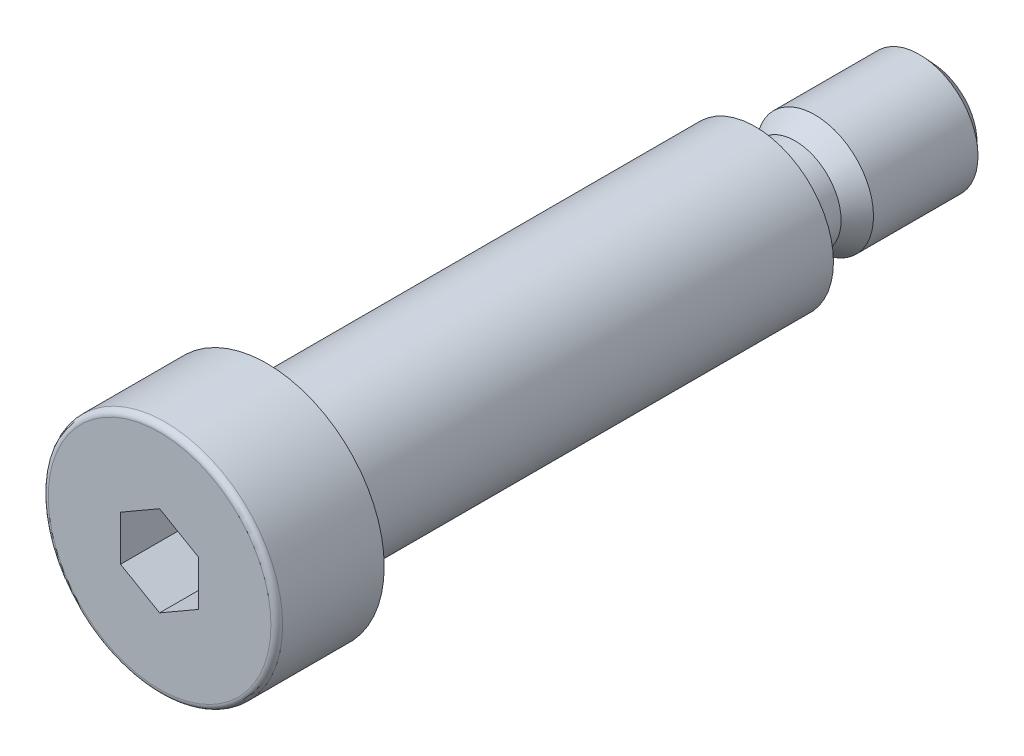
ISO-10303-21;
HEADER;
FILE_DESCRIPTION(('STEP AP214'),'2;1');
FILE_NAME('part.step','',(''),(''),'','','');
FILE_SCHEMA(('AUTOMOTIVE_DESIGN { 1 0 10303 214 1 1 1 1 }'));
ENDSEC;
DATA;
#1=APPLICATION_CONTEXT('core data for automotive mechanical design processes');
#2=APPLICATION_PROTOCOL_DEFINITION('international standard','automotive_design',2000,#1);
#3=PRODUCT_CONTEXT('',#1,'mechanical');
#4=PRODUCT('Part','Part','',(#3));
#5=PRODUCT_RELATED_PRODUCT_CATEGORY('part','',(#4));
#6=PRODUCT_DEFINITION_FORMATION('','',#4);
#7=PRODUCT_DEFINITION_CONTEXT('part definition',#1,'design');
#8=PRODUCT_DEFINITION('design','',#6,#7);
#9=PRODUCT_DEFINITION_SHAPE('','',#8);
#10=(LENGTH_UNIT() NAMED_UNIT(*) SI_UNIT(.MILLI.,.METRE.));
#11=(NAMED_UNIT(*) PLANE_ANGLE_UNIT() SI_UNIT($,.RADIAN.));
#12=(NAMED_UNIT(*) SI_UNIT($,.STERADIAN.) SOLID_ANGLE_UNIT());
#13=UNCERTAINTY_MEASURE_WITH_UNIT(LENGTH_MEASURE(1.E-05),#10,'distance_accuracy_value','');
#14=(GEOMETRIC_REPRESENTATION_CONTEXT(3) GLOBAL_UNCERTAINTY_ASSIGNED_CONTEXT((#13)) GLOBAL_UNIT_ASSIGNED_CONTEXT((#10,
#11,#12)) REPRESENTATION_CONTEXT('',''));
#15=CARTESIAN_POINT('',(0.,0.,0.));
#16=DIRECTION('',(0.,0.,1.));
#17=DIRECTION('',(1.,0.,0.));
#18=AXIS2_PLACEMENT_3D('',#15,#16,#17);
#19=CARTESIAN_POINT('',(0.,0.,36.));
#20=DIRECTION('',(0.,0.,1.));
#21=DIRECTION('',(1.,0.,0.));
#22=AXIS2_PLACEMENT_3D('',#19,#20,#21);
#23=PLANE('',#22);
#24=CARTESIAN_POINT('',(0.,0.,36.));
#25=DIRECTION('',(0.,0.,1.));
#26=DIRECTION('',(1.,0.,0.));
#27=AXIS2_PLACEMENT_3D('',#24,#25,#26);
#28=CIRCLE('',#27,11.4);
#29=CARTESIAN_POINT('',(11.4,0.,36.));
#30=VERTEX_POINT('',#29);
#31=EDGE_CURVE('E42',#30,#30,#28,.T.);
#32=ORIENTED_EDGE('',*,*,#31,.T.);
#33=EDGE_LOOP('',(#32));
#34=FACE_BOUND('',#33,.T.);
#35=DIRECTION('',(0.,1.,0.));
#36=VECTOR('',#35,1.);
#37=CARTESIAN_POINT('',(4.,-2.30940107675851,36.));
#38=LINE('',#37,#36);
#39=CARTESIAN_POINT('',(4.,-2.30940107675851,36.));
#40=VERTEX_POINT('',#39);
#41=CARTESIAN_POINT('',(4.,2.3094010767585,36.));
#42=VERTEX_POINT('',#41);
#43=EDGE_CURVE('E49',#40,#42,#38,.T.);
#44=ORIENTED_EDGE('',*,*,#43,.F.);
#45=DIRECTION('',(0.866025403784439,0.5,0.));
#46=VECTOR('',#45,1.);
#47=CARTESIAN_POINT('',(0.,-4.61880215351701,36.));
#48=LINE('',#47,#46);
#49=CARTESIAN_POINT('',(0.,-4.61880215351701,36.));
#50=VERTEX_POINT('',#49);
#51=EDGE_CURVE('E132',#50,#40,#48,.T.);
#52=ORIENTED_EDGE('',*,*,#51,.F.);
#53=DIRECTION('',(0.866025403784439,-0.5,0.));
#54=VECTOR('',#53,1.);
#55=CARTESIAN_POINT('',(-4.,-2.3094010767585,36.));
#56=LINE('',#55,#54);
#57=CARTESIAN_POINT('',(-4.,-2.3094010767585,36.));
#58=VERTEX_POINT('',#57);
#59=EDGE_CURVE('E130',#58,#50,#56,.T.);
#60=ORIENTED_EDGE('',*,*,#59,.F.);
#61=DIRECTION('',(0.,-1.,0.));
#62=VECTOR('',#61,1.);
#63=CARTESIAN_POINT('',(-4.,2.30940107675851,36.));
#64=LINE('',#63,#62);
#65=CARTESIAN_POINT('',(-4.,2.30940107675851,36.));
#66=VERTEX_POINT('',#65);
#67=EDGE_CURVE('E97',#66,#58,#64,.T.);
#68=ORIENTED_EDGE('',*,*,#67,.F.);
#69=DIRECTION('',(-0.866025403784439,-0.5,0.));
#70=VECTOR('',#69,1.);
#71=CARTESIAN_POINT('',(0.,4.61880215351701,36.));
#72=LINE('',#71,#70);
#73=CARTESIAN_POINT('',(0.,4.61880215351701,36.));
#74=VERTEX_POINT('',#73);
#75=EDGE_CURVE('E126',#74,#66,#72,.T.);
#76=ORIENTED_EDGE('',*,*,#75,.F.);
#77=DIRECTION('',(-0.866025403784439,0.5,0.));
#78=VECTOR('',#77,1.);
#79=CARTESIAN_POINT('',(4.,2.3094010767585,36.));
#80=LINE('',#79,#78);
#81=EDGE_CURVE('E123',#42,#74,#80,.T.);
#82=ORIENTED_EDGE('',*,*,#81,.F.);
#83=EDGE_LOOP('',(#44,#52,#60,#68,#76,#82));
#84=FACE_BOUND('',#83,.T.);
#85=ADVANCED_FACE('F34',(#34,#84),#23,.T.);
#86=CARTESIAN_POINT('',(0.,0.,-43.));
#87=DIRECTION('',(0.,0.,1.));
#88=DIRECTION('',(1.,0.,0.));
#89=AXIS2_PLACEMENT_3D('',#86,#87,#88);
#90=PLANE('',#89);
#91=CARTESIAN_POINT('',(0.,0.,-43.));
#92=DIRECTION('',(0.,0.,1.));
#93=DIRECTION('',(1.,0.,0.));
#94=AXIS2_PLACEMENT_3D('',#91,#92,#93);
#95=CIRCLE('',#94,4.7);
#96=CARTESIAN_POINT('',(4.7,0.,-43.));
#97=VERTEX_POINT('',#96);
#98=EDGE_CURVE('E162',#97,#97,#95,.T.);
#99=ORIENTED_EDGE('',*,*,#98,.F.);
#100=EDGE_LOOP('',(#99));
#101=FACE_BOUND('',#100,.T.);
#102=ADVANCED_FACE('F178',(#101),#90,.F.);
#103=CARTESIAN_POINT('',(0.,0.,-43.));
#104=DIRECTION('',(0.,0.,1.));
#105=DIRECTION('',(1.,0.,0.));
#106=AXIS2_PLACEMENT_3D('',#103,#104,#105);
#107=CONICAL_SURFACE('',#106,4.7,0.825376850520729);
#108=CARTESIAN_POINT('',(0.,0.,-41.8));
#109=DIRECTION('',(0.,0.,1.));
#110=DIRECTION('',(1.,0.,0.));
#111=AXIS2_PLACEMENT_3D('',#108,#109,#110);
#112=CIRCLE('',#111,6.);
#113=CARTESIAN_POINT('',(6.,0.,-41.8));
#114=VERTEX_POINT('',#113);
#115=EDGE_CURVE('E159',#114,#114,#112,.T.);
#116=ORIENTED_EDGE('',*,*,#115,.F.);
#117=EDGE_LOOP('',(#116));
#118=FACE_BOUND('',#117,.T.);
#119=ORIENTED_EDGE('',*,*,#98,.T.);
#120=EDGE_LOOP('',(#119));
#121=FACE_BOUND('',#120,.T.);
#122=ADVANCED_FACE('F182',(#118,#121),#107,.T.);
#123=CARTESIAN_POINT('',(0.,0.,36.));
#124=DIRECTION('',(0.,0.,1.));
#125=DIRECTION('',(1.,0.,0.));
#126=AXIS2_PLACEMENT_3D('',#123,#124,#125);
#127=CYLINDRICAL_SURFACE('',#126,6.);
#128=CARTESIAN_POINT('',(0.,0.,-31.1));
#129=DIRECTION('',(0.,0.,1.));
#130=DIRECTION('',(1.,0.,0.));
#131=AXIS2_PLACEMENT_3D('',#128,#129,#130);
#132=CIRCLE('',#131,6.);
#133=CARTESIAN_POINT('',(6.,0.,-31.1));
#134=VERTEX_POINT('',#133);
#135=EDGE_CURVE('E156',#134,#134,#132,.T.);
#136=ORIENTED_EDGE('',*,*,#135,.F.);
#137=EDGE_LOOP('',(#136));
#138=FACE_BOUND('',#137,.T.);
#139=ORIENTED_EDGE('',*,*,#115,.T.);
#140=EDGE_LOOP('',(#139));
#141=FACE_BOUND('',#140,.T.);
#142=ADVANCED_FACE('F188',(#138,#141),#127,.T.);
#143=CARTESIAN_POINT('',(0.,0.,-31.1));
#144=DIRECTION('',(0.,0.,-1.));
#145=DIRECTION('',(-1.,0.,0.));
#146=AXIS2_PLACEMENT_3D('',#143,#144,#145);
#147=CONICAL_SURFACE('',#146,6.,0.571837729916959);
#148=CARTESIAN_POINT('',(0.,0.,-29.08));
#149=DIRECTION('',(0.,0.,1.));
#150=DIRECTION('',(1.,0.,0.));
#151=AXIS2_PLACEMENT_3D('',#148,#149,#150);
#152=CIRCLE('',#151,4.70000000000001);
#153=CARTESIAN_POINT('',(4.70000000000001,0.,-29.08));
#154=VERTEX_POINT('',#153);
#155=EDGE_CURVE('E153',#154,#154,#152,.T.);
#156=ORIENTED_EDGE('',*,*,#155,.F.);
#157=EDGE_LOOP('',(#156));
#158=FACE_BOUND('',#157,.T.);
#159=ORIENTED_EDGE('',*,*,#135,.T.);
#160=EDGE_LOOP('',(#159));
#161=FACE_BOUND('',#160,.T.);
#162=ADVANCED_FACE('F192',(#158,#161),#147,.T.);
#163=CARTESIAN_POINT('',(0.,0.,36.));
#164=DIRECTION('',(0.,0.,1.));
#165=DIRECTION('',(1.,0.,0.));
#166=AXIS2_PLACEMENT_3D('',#163,#164,#165);
#167=CYLINDRICAL_SURFACE('',#166,4.70000000000001);
#168=ORIENTED_EDGE('',*,*,#155,.T.);
#169=EDGE_LOOP('',(#168));
#170=FACE_BOUND('',#169,.T.);
#171=CARTESIAN_POINT('',(0.,0.,-25.));
#172=DIRECTION('',(0.,0.,1.));
#173=DIRECTION('',(1.,0.,0.));
#174=AXIS2_PLACEMENT_3D('',#171,#172,#173);
#175=CIRCLE('',#174,4.7);
#176=CARTESIAN_POINT('',(4.7,0.,-25.));
#177=VERTEX_POINT('',#176);
#178=EDGE_CURVE('E150',#177,#177,#175,.T.);
#179=ORIENTED_EDGE('',*,*,#178,.F.);
#180=EDGE_LOOP('',(#179));
#181=FACE_BOUND('',#180,.T.);
#182=ADVANCED_FACE('F196',(#170,#181),#167,.T.);
#183=CARTESIAN_POINT('',(0.,0.,-25.));
#184=DIRECTION('',(0.,0.,1.));
#185=DIRECTION('',(1.,0.,0.));
#186=AXIS2_PLACEMENT_3D('',#183,#184,#185);
#187=PLANE('',#186);
#188=CARTESIAN_POINT('',(0.,0.,-25.));
#189=DIRECTION('',(0.,0.,1.));
#190=DIRECTION('',(1.,0.,0.));
#191=AXIS2_PLACEMENT_3D('',#188,#189,#190);
#192=CIRCLE('',#191,7.99999999999999);
#193=CARTESIAN_POINT('',(7.99999999999999,0.,-25.));
#194=VERTEX_POINT('',#193);
#195=EDGE_CURVE('E147',#194,#194,#192,.T.);
#196=ORIENTED_EDGE('',*,*,#195,.F.);
#197=EDGE_LOOP('',(#196));
#198=FACE_BOUND('',#197,.T.);
#199=ORIENTED_EDGE('',*,*,#178,.T.);
#200=EDGE_LOOP('',(#199));
#201=FACE_BOUND('',#200,.T.);
#202=ADVANCED_FACE('F200',(#198,#201),#187,.F.);
#203=CARTESIAN_POINT('',(0.,0.,36.));
#204=DIRECTION('',(0.,0.,1.));
#205=DIRECTION('',(1.,0.,0.));
#206=AXIS2_PLACEMENT_3D('',#203,#204,#205);
#207=CYLINDRICAL_SURFACE('',#206,7.99999999999999);
#208=ORIENTED_EDGE('',*,*,#195,.T.);
#209=EDGE_LOOP('',(#208));
#210=FACE_BOUND('',#209,.T.);
#211=CARTESIAN_POINT('',(0.,0.,25.));
#212=DIRECTION('',(0.,0.,1.));
#213=DIRECTION('',(1.,0.,0.));
#214=AXIS2_PLACEMENT_3D('',#211,#212,#213);
#215=CIRCLE('',#214,7.99999999999999);
#216=CARTESIAN_POINT('',(7.99999999999999,0.,25.));
#217=VERTEX_POINT('',#216);
#218=EDGE_CURVE('E144',#217,#217,#215,.T.);
#219=ORIENTED_EDGE('',*,*,#218,.F.);
#220=EDGE_LOOP('',(#219));
#221=FACE_BOUND('',#220,.T.);
#222=ADVANCED_FACE('F204',(#210,#221),#207,.T.);
#223=CARTESIAN_POINT('',(0.,0.,25.));
#224=DIRECTION('',(0.,0.,1.));
#225=DIRECTION('',(1.,0.,0.));
#226=AXIS2_PLACEMENT_3D('',#223,#224,#225);
#227=PLANE('',#226);
#228=CARTESIAN_POINT('',(0.,0.,25.));
#229=DIRECTION('',(0.,0.,1.));
#230=DIRECTION('',(1.,0.,0.));
#231=AXIS2_PLACEMENT_3D('',#228,#229,#230);
#232=CIRCLE('',#231,12.);
#233=CARTESIAN_POINT('',(12.,0.,25.));
#234=VERTEX_POINT('',#233);
#235=EDGE_CURVE('E136',#234,#234,#232,.T.);
#236=ORIENTED_EDGE('',*,*,#235,.F.);
#237=EDGE_LOOP('',(#236));
#238=FACE_BOUND('',#237,.T.);
#239=ORIENTED_EDGE('',*,*,#218,.T.);
#240=EDGE_LOOP('',(#239));
#241=FACE_BOUND('',#240,.T.);
#242=ADVANCED_FACE('F208',(#238,#241),#227,.F.);
#243=CARTESIAN_POINT('',(0.,0.,36.));
#244=DIRECTION('',(0.,0.,1.));
#245=DIRECTION('',(1.,0.,0.));
#246=AXIS2_PLACEMENT_3D('',#243,#244,#245);
#247=CYLINDRICAL_SURFACE('',#246,12.);
#248=CARTESIAN_POINT('',(0.,0.,35.4));
#249=DIRECTION('',(0.,0.,1.));
#250=DIRECTION('',(1.,0.,0.));
#251=AXIS2_PLACEMENT_3D('',#248,#249,#250);
#252=CIRCLE('',#251,12.);
#253=CARTESIAN_POINT('',(12.,0.,35.4));
#254=VERTEX_POINT('',#253);
#255=EDGE_CURVE('E11',#254,#254,#252,.F.);
#256=ORIENTED_EDGE('',*,*,#255,.T.);
#257=EDGE_LOOP('',(#256));
#258=FACE_BOUND('',#257,.T.);
#259=ORIENTED_EDGE('',*,*,#235,.T.);
#260=EDGE_LOOP('',(#259));
#261=FACE_BOUND('',#260,.T.);
#262=ADVANCED_FACE('F212',(#258,#261),#247,.T.);
#263=CARTESIAN_POINT('',(4.,-2.30940107675851,29.4));
#264=DIRECTION('',(1.,0.,0.));
#265=DIRECTION('',(0.,0.,-1.));
#266=AXIS2_PLACEMENT_3D('',#263,#264,#265);
#267=PLANE('',#266);
#268=ORIENTED_EDGE('',*,*,#43,.T.);
#269=DIRECTION('',(0.,0.,1.));
#270=VECTOR('',#269,1.);
#271=CARTESIAN_POINT('',(4.,2.3094010767585,29.4));
#272=LINE('',#271,#270);
#273=CARTESIAN_POINT('',(4.,2.3094010767585,29.4));
#274=VERTEX_POINT('',#273);
#275=EDGE_CURVE('E79',#274,#42,#272,.T.);
#276=ORIENTED_EDGE('',*,*,#275,.F.);
#277=DIRECTION('',(0.,1.,0.));
#278=VECTOR('',#277,1.);
#279=CARTESIAN_POINT('',(4.,-2.30940107675851,29.4));
#280=LINE('',#279,#278);
#281=CARTESIAN_POINT('',(4.,-2.30940107675851,29.4));
#282=VERTEX_POINT('',#281);
#283=EDGE_CURVE('E134',#282,#274,#280,.T.);
#284=ORIENTED_EDGE('',*,*,#283,.F.);
#285=DIRECTION('',(0.,0.,1.));
#286=VECTOR('',#285,1.);
#287=CARTESIAN_POINT('',(4.,-2.30940107675851,29.4));
#288=LINE('',#287,#286);
#289=EDGE_CURVE('E57',#282,#40,#288,.T.);
#290=ORIENTED_EDGE('',*,*,#289,.T.);
#291=EDGE_LOOP('',(#268,#276,#284,#290));
#292=FACE_BOUND('',#291,.T.);
#293=ADVANCED_FACE('F216',(#292),#267,.F.);
#294=CARTESIAN_POINT('',(0.,-4.61880215351701,29.4));
#295=DIRECTION('',(0.5,-0.866025403784439,0.));
#296=DIRECTION('',(0.866025403784439,0.5,0.));
#297=AXIS2_PLACEMENT_3D('',#294,#295,#296);
#298=PLANE('',#297);
#299=ORIENTED_EDGE('',*,*,#51,.T.);
#300=ORIENTED_EDGE('',*,*,#289,.F.);
#301=DIRECTION('',(0.866025403784439,0.5,0.));
#302=VECTOR('',#301,1.);
#303=CARTESIAN_POINT('',(0.,-4.61880215351701,29.4));
#304=LINE('',#303,#302);
#305=CARTESIAN_POINT('',(0.,-4.61880215351701,29.4));
#306=VERTEX_POINT('',#305);
#307=EDGE_CURVE('E109',#306,#282,#304,.T.);
#308=ORIENTED_EDGE('',*,*,#307,.F.);
#309=DIRECTION('',(0.,0.,1.));
#310=VECTOR('',#309,1.);
#311=CARTESIAN_POINT('',(0.,-4.61880215351701,29.4));
#312=LINE('',#311,#310);
#313=EDGE_CURVE('E101',#306,#50,#312,.T.);
#314=ORIENTED_EDGE('',*,*,#313,.T.);
#315=EDGE_LOOP('',(#299,#300,#308,#314));
#316=FACE_BOUND('',#315,.T.);
#317=ADVANCED_FACE('F220',(#316),#298,.F.);
#318=CARTESIAN_POINT('',(-4.,-2.3094010767585,29.4));
#319=DIRECTION('',(-0.5,-0.866025403784439,0.));
#320=DIRECTION('',(0.866025403784439,-0.5,0.));
#321=AXIS2_PLACEMENT_3D('',#318,#319,#320);
#322=PLANE('',#321);
#323=ORIENTED_EDGE('',*,*,#59,.T.);
#324=ORIENTED_EDGE('',*,*,#313,.F.);
#325=DIRECTION('',(0.866025403784439,-0.5,0.));
#326=VECTOR('',#325,1.);
#327=CARTESIAN_POINT('',(-4.,-2.3094010767585,29.4));
#328=LINE('',#327,#326);
#329=CARTESIAN_POINT('',(-4.,-2.3094010767585,29.4));
#330=VERTEX_POINT('',#329);
#331=EDGE_CURVE('E105',#330,#306,#328,.T.);
#332=ORIENTED_EDGE('',*,*,#331,.F.);
#333=DIRECTION('',(0.,0.,1.));
#334=VECTOR('',#333,1.);
#335=CARTESIAN_POINT('',(-4.,-2.3094010767585,29.4));
#336=LINE('',#335,#334);
#337=EDGE_CURVE('E90',#330,#58,#336,.T.);
#338=ORIENTED_EDGE('',*,*,#337,.T.);
#339=EDGE_LOOP('',(#323,#324,#332,#338));
#340=FACE_BOUND('',#339,.T.);
#341=ADVANCED_FACE('F106',(#340),#322,.F.);
#342=CARTESIAN_POINT('',(-4.,2.30940107675851,29.4));
#343=DIRECTION('',(-1.,0.,0.));
#344=DIRECTION('',(0.,-1.,0.));
#345=AXIS2_PLACEMENT_3D('',#342,#343,#344);
#346=PLANE('',#345);
#347=ORIENTED_EDGE('',*,*,#67,.T.);
#348=ORIENTED_EDGE('',*,*,#337,.F.);
#349=DIRECTION('',(0.,-1.,0.));
#350=VECTOR('',#349,1.);
#351=CARTESIAN_POINT('',(-4.,2.30940107675851,29.4));
#352=LINE('',#351,#350);
#353=CARTESIAN_POINT('',(-4.,2.30940107675851,29.4));
#354=VERTEX_POINT('',#353);
#355=EDGE_CURVE('E94',#354,#330,#352,.T.);
#356=ORIENTED_EDGE('',*,*,#355,.F.);
#357=DIRECTION('',(0.,0.,1.));
#358=VECTOR('',#357,1.);
#359=CARTESIAN_POINT('',(-4.,2.30940107675851,29.4));
#360=LINE('',#359,#358);
#361=EDGE_CURVE('E102',#354,#66,#360,.T.);
#362=ORIENTED_EDGE('',*,*,#361,.T.);
#363=EDGE_LOOP('',(#347,#348,#356,#362));
#364=FACE_BOUND('',#363,.T.);
#365=ADVANCED_FACE('F92',(#364),#346,.F.);
#366=CARTESIAN_POINT('',(0.,4.61880215351701,29.4));
#367=DIRECTION('',(-0.5,0.866025403784439,0.));
#368=DIRECTION('',(-0.866025403784439,-0.5,0.));
#369=AXIS2_PLACEMENT_3D('',#366,#367,#368);
#370=PLANE('',#369);
#371=ORIENTED_EDGE('',*,*,#75,.T.);
#372=ORIENTED_EDGE('',*,*,#361,.F.);
#373=DIRECTION('',(-0.866025403784439,-0.5,0.));
#374=VECTOR('',#373,1.);
#375=CARTESIAN_POINT('',(0.,4.61880215351701,29.4));
#376=LINE('',#375,#374);
#377=CARTESIAN_POINT('',(0.,4.61880215351701,29.4));
#378=VERTEX_POINT('',#377);
#379=EDGE_CURVE('E115',#378,#354,#376,.T.);
#380=ORIENTED_EDGE('',*,*,#379,.F.);
#381=DIRECTION('',(0.,0.,1.));
#382=VECTOR('',#381,1.);
#383=CARTESIAN_POINT('',(0.,4.61880215351701,29.4));
#384=LINE('',#383,#382);
#385=EDGE_CURVE('E139',#378,#74,#384,.T.);
#386=ORIENTED_EDGE('',*,*,#385,.T.);
#387=EDGE_LOOP('',(#371,#372,#380,#386));
#388=FACE_BOUND('',#387,.T.);
#389=ADVANCED_FACE('F223',(#388),#370,.F.);
#390=CARTESIAN_POINT('',(4.,2.3094010767585,29.4));
#391=DIRECTION('',(0.5,0.866025403784439,0.));
#392=DIRECTION('',(-0.866025403784439,0.5,0.));
#393=AXIS2_PLACEMENT_3D('',#390,#391,#392);
#394=PLANE('',#393);
#395=ORIENTED_EDGE('',*,*,#81,.T.);
#396=ORIENTED_EDGE('',*,*,#385,.F.);
#397=DIRECTION('',(-0.866025403784439,0.5,0.));
#398=VECTOR('',#397,1.);
#399=CARTESIAN_POINT('',(4.,2.3094010767585,29.4));
#400=LINE('',#399,#398);
#401=EDGE_CURVE('E117',#274,#378,#400,.T.);
#402=ORIENTED_EDGE('',*,*,#401,.F.);
#403=ORIENTED_EDGE('',*,*,#275,.T.);
#404=EDGE_LOOP('',(#395,#396,#402,#403));
#405=FACE_BOUND('',#404,.T.);
#406=ADVANCED_FACE('F174',(#405),#394,.F.);
#407=CARTESIAN_POINT('',(0.,0.,29.4));
#408=DIRECTION('',(0.,0.,1.));
#409=DIRECTION('',(1.,0.,0.));
#410=AXIS2_PLACEMENT_3D('',#407,#408,#409);
#411=PLANE('',#410);
#412=ORIENTED_EDGE('',*,*,#283,.T.);
#413=ORIENTED_EDGE('',*,*,#401,.T.);
#414=ORIENTED_EDGE('',*,*,#379,.T.);
#415=ORIENTED_EDGE('',*,*,#355,.T.);
#416=ORIENTED_EDGE('',*,*,#331,.T.);
#417=ORIENTED_EDGE('',*,*,#307,.T.);
#418=EDGE_LOOP('',(#412,#413,#414,#415,#416,#417));
#419=FACE_BOUND('',#418,.T.);
#420=ADVANCED_FACE('F112',(#419),#411,.T.);
#421=CARTESIAN_POINT('',(0.,0.,35.4));
#422=DIRECTION('',(0.,0.,1.));
#423=DIRECTION('',(1.,0.,0.));
#424=AXIS2_PLACEMENT_3D('',#421,#422,#423);
#425=TOROIDAL_SURFACE('',#424,11.4,0.6);
#426=ORIENTED_EDGE('',*,*,#255,.F.);
#427=EDGE_LOOP('',(#426));
#428=FACE_BOUND('',#427,.T.);
#429=ORIENTED_EDGE('',*,*,#31,.F.);
#430=EDGE_LOOP('',(#429));
#431=FACE_BOUND('',#430,.T.);
#432=ADVANCED_FACE('F36',(#428,#431),#425,.T.);
#433=CLOSED_SHELL('',(#85,#102,#122,#142,#162,#182,#202,#222,#242,#262,#293,#317,#341,#365,#389,
#406,#420,#432));
#434=MANIFOLD_SOLID_BREP('B2',#433);
#435=ADVANCED_BREP_SHAPE_REPRESENTATION('',(#18,#434),#14);
#436=SHAPE_DEFINITION_REPRESENTATION(#9,#435);
ENDSEC;
END-ISO-10303-21;
